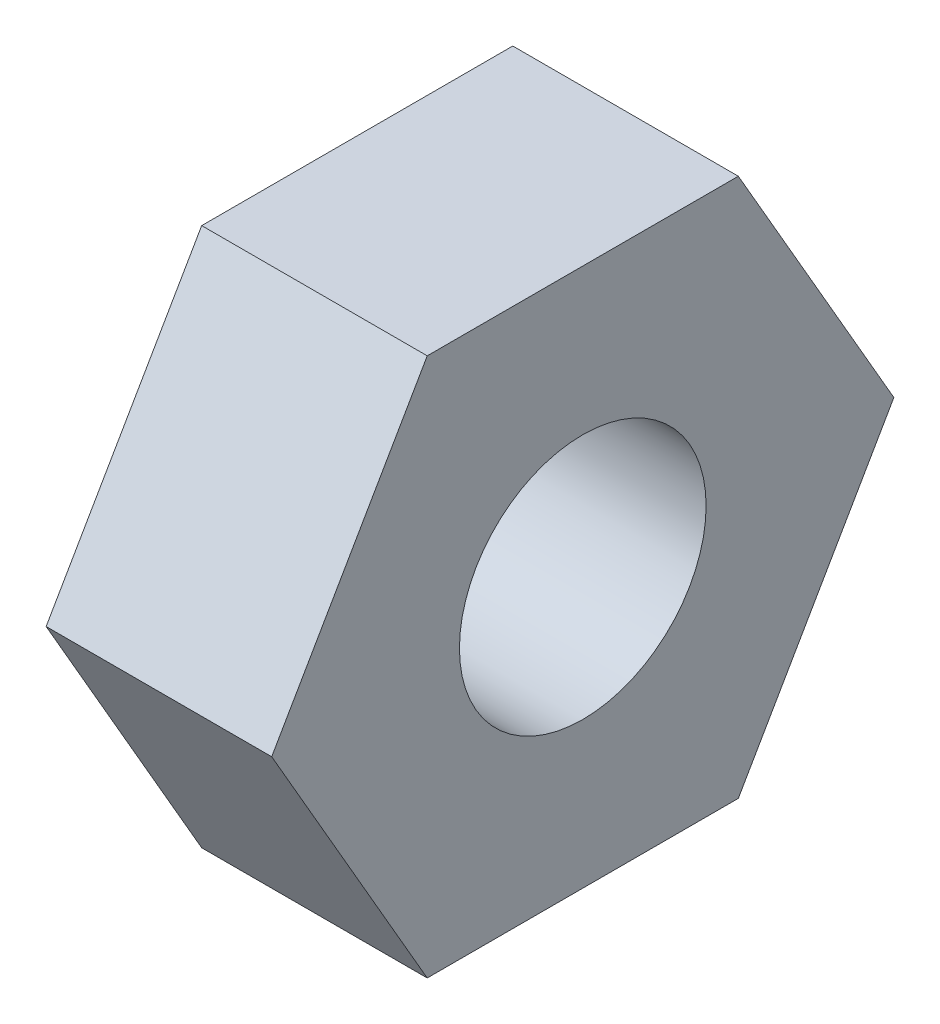
ISO-10303-21;
HEADER;
FILE_DESCRIPTION(('STEP AP214'),'2;1');
FILE_NAME('part.step','',(''),(''),'','','');
FILE_SCHEMA(('AUTOMOTIVE_DESIGN { 1 0 10303 214 1 1 1 1 }'));
ENDSEC;
DATA;
#1=APPLICATION_CONTEXT('core data for automotive mechanical design processes');
#2=APPLICATION_PROTOCOL_DEFINITION('international standard','automotive_design',2000,#1);
#3=PRODUCT_CONTEXT('',#1,'mechanical');
#4=PRODUCT('Part','Part','',(#3));
#5=PRODUCT_RELATED_PRODUCT_CATEGORY('part','',(#4));
#6=PRODUCT_DEFINITION_FORMATION('','',#4);
#7=PRODUCT_DEFINITION_CONTEXT('part definition',#1,'design');
#8=PRODUCT_DEFINITION('design','',#6,#7);
#9=PRODUCT_DEFINITION_SHAPE('','',#8);
#10=(LENGTH_UNIT() NAMED_UNIT(*) SI_UNIT(.MILLI.,.METRE.));
#11=(NAMED_UNIT(*) PLANE_ANGLE_UNIT() SI_UNIT($,.RADIAN.));
#12=(NAMED_UNIT(*) SI_UNIT($,.STERADIAN.) SOLID_ANGLE_UNIT());
#13=UNCERTAINTY_MEASURE_WITH_UNIT(LENGTH_MEASURE(1.E-05),#10,'distance_accuracy_value','');
#14=(GEOMETRIC_REPRESENTATION_CONTEXT(3) GLOBAL_UNCERTAINTY_ASSIGNED_CONTEXT((#13)) GLOBAL_UNIT_ASSIGNED_CONTEXT((#10,
#11,#12)) REPRESENTATION_CONTEXT('',''));
#15=CARTESIAN_POINT('',(0.,0.,0.));
#16=DIRECTION('',(0.,0.,1.));
#17=DIRECTION('',(1.,0.,0.));
#18=AXIS2_PLACEMENT_3D('',#15,#16,#17);
#19=CARTESIAN_POINT('',(2.286,-2.73049999999998,-1.57645491002231));
#20=DIRECTION('',(0.,0.499999999999995,0.866025403784441));
#21=DIRECTION('',(0.,-0.866025403784442,0.499999999999995));
#22=AXIS2_PLACEMENT_3D('',#19,#20,#21);
#23=PLANE('',#22);
#24=DIRECTION('',(0.,0.866025403784441,-0.499999999999995));
#25=VECTOR('',#24,1.);
#26=CARTESIAN_POINT('',(0.,-2.73049999999998,-1.57645491002231));
#27=LINE('',#26,#25);
#28=CARTESIAN_POINT('',(0.,-2.73049999999998,-1.57645491002231));
#29=VERTEX_POINT('',#28);
#30=CARTESIAN_POINT('',(0.,0.,-3.15290982004455));
#31=VERTEX_POINT('',#30);
#32=EDGE_CURVE('E125',#29,#31,#27,.T.);
#33=ORIENTED_EDGE('',*,*,#32,.T.);
#34=DIRECTION('',(-1.,0.,0.));
#35=VECTOR('',#34,1.);
#36=CARTESIAN_POINT('',(2.286,0.,-3.15290982004455));
#37=LINE('',#36,#35);
#38=CARTESIAN_POINT('',(2.286,0.,-3.15290982004455));
#39=VERTEX_POINT('',#38);
#40=EDGE_CURVE('E11',#39,#31,#37,.T.);
#41=ORIENTED_EDGE('',*,*,#40,.F.);
#42=DIRECTION('',(0.,0.866025403784441,-0.499999999999995));
#43=VECTOR('',#42,1.);
#44=CARTESIAN_POINT('',(2.286,-2.73049999999998,-1.57645491002231));
#45=LINE('',#44,#43);
#46=CARTESIAN_POINT('',(2.286,-2.73049999999998,-1.57645491002231));
#47=VERTEX_POINT('',#46);
#48=EDGE_CURVE('E136',#47,#39,#45,.T.);
#49=ORIENTED_EDGE('',*,*,#48,.F.);
#50=DIRECTION('',(-1.,0.,0.));
#51=VECTOR('',#50,1.);
#52=CARTESIAN_POINT('',(2.286,-2.73049999999998,-1.57645491002231));
#53=LINE('',#52,#51);
#54=EDGE_CURVE('E121',#47,#29,#53,.T.);
#55=ORIENTED_EDGE('',*,*,#54,.T.);
#56=EDGE_LOOP('',(#33,#41,#49,#55));
#57=FACE_BOUND('',#56,.T.);
#58=ADVANCED_FACE('F41',(#57),#23,.F.);
#59=CARTESIAN_POINT('',(2.286,0.,-3.15290982004455));
#60=DIRECTION('',(0.,-0.500000000000001,0.866025403784438));
#61=DIRECTION('',(0.,-0.866025403784438,-0.500000000000001));
#62=AXIS2_PLACEMENT_3D('',#59,#60,#61);
#63=PLANE('',#62);
#64=DIRECTION('',(0.,0.866025403784438,0.500000000000001));
#65=VECTOR('',#64,1.);
#66=CARTESIAN_POINT('',(0.,0.,-3.15290982004455));
#67=LINE('',#66,#65);
#68=CARTESIAN_POINT('',(0.,2.73050000000001,-1.57645491002227));
#69=VERTEX_POINT('',#68);
#70=EDGE_CURVE('E128',#31,#69,#67,.T.);
#71=ORIENTED_EDGE('',*,*,#70,.T.);
#72=DIRECTION('',(-1.,0.,0.));
#73=VECTOR('',#72,1.);
#74=CARTESIAN_POINT('',(2.286,2.73050000000001,-1.57645491002227));
#75=LINE('',#74,#73);
#76=CARTESIAN_POINT('',(2.286,2.73050000000001,-1.57645491002227));
#77=VERTEX_POINT('',#76);
#78=EDGE_CURVE('E49',#77,#69,#75,.T.);
#79=ORIENTED_EDGE('',*,*,#78,.F.);
#80=DIRECTION('',(0.,0.866025403784438,0.500000000000001));
#81=VECTOR('',#80,1.);
#82=CARTESIAN_POINT('',(2.286,0.,-3.15290982004455));
#83=LINE('',#82,#81);
#84=EDGE_CURVE('E94',#39,#77,#83,.T.);
#85=ORIENTED_EDGE('',*,*,#84,.F.);
#86=ORIENTED_EDGE('',*,*,#40,.T.);
#87=EDGE_LOOP('',(#71,#79,#85,#86));
#88=FACE_BOUND('',#87,.T.);
#89=ADVANCED_FACE('F161',(#88),#63,.F.);
#90=CARTESIAN_POINT('',(2.286,2.73050000000001,-1.57645491002227));
#91=DIRECTION('',(0.,-1.,0.));
#92=DIRECTION('',(0.,0.,-1.));
#93=AXIS2_PLACEMENT_3D('',#90,#91,#92);
#94=PLANE('',#93);
#95=DIRECTION('',(0.,0.,1.));
#96=VECTOR('',#95,1.);
#97=CARTESIAN_POINT('',(0.,2.73050000000001,-1.57645491002227));
#98=LINE('',#97,#96);
#99=CARTESIAN_POINT('',(0.,2.73049999999999,1.57645491002229));
#100=VERTEX_POINT('',#99);
#101=EDGE_CURVE('E131',#69,#100,#98,.T.);
#102=ORIENTED_EDGE('',*,*,#101,.T.);
#103=DIRECTION('',(-1.,0.,0.));
#104=VECTOR('',#103,1.);
#105=CARTESIAN_POINT('',(2.286,2.73049999999999,1.57645491002229));
#106=LINE('',#105,#104);
#107=CARTESIAN_POINT('',(2.286,2.73049999999999,1.57645491002229));
#108=VERTEX_POINT('',#107);
#109=EDGE_CURVE('E116',#108,#100,#106,.T.);
#110=ORIENTED_EDGE('',*,*,#109,.F.);
#111=DIRECTION('',(0.,0.,1.));
#112=VECTOR('',#111,1.);
#113=CARTESIAN_POINT('',(2.286,2.73050000000001,-1.57645491002227));
#114=LINE('',#113,#112);
#115=EDGE_CURVE('E107',#77,#108,#114,.T.);
#116=ORIENTED_EDGE('',*,*,#115,.F.);
#117=ORIENTED_EDGE('',*,*,#78,.T.);
#118=EDGE_LOOP('',(#102,#110,#116,#117));
#119=FACE_BOUND('',#118,.T.);
#120=ADVANCED_FACE('F142',(#119),#94,.F.);
#121=CARTESIAN_POINT('',(2.286,2.73049999999999,1.57645491002229));
#122=DIRECTION('',(0.,-0.499999999999995,-0.866025403784442));
#123=DIRECTION('',(0.,0.866025403784442,-0.499999999999995));
#124=AXIS2_PLACEMENT_3D('',#121,#122,#123);
#125=PLANE('',#124);
#126=DIRECTION('',(0.,-0.866025403784441,0.499999999999995));
#127=VECTOR('',#126,1.);
#128=CARTESIAN_POINT('',(0.,2.73049999999999,1.57645491002229));
#129=LINE('',#128,#127);
#130=CARTESIAN_POINT('',(0.,0.,3.15290982004455));
#131=VERTEX_POINT('',#130);
#132=EDGE_CURVE('E115',#100,#131,#129,.T.);
#133=ORIENTED_EDGE('',*,*,#132,.T.);
#134=DIRECTION('',(-1.,0.,0.));
#135=VECTOR('',#134,1.);
#136=CARTESIAN_POINT('',(2.286,0.,3.15290982004455));
#137=LINE('',#136,#135);
#138=CARTESIAN_POINT('',(2.286,0.,3.15290982004455));
#139=VERTEX_POINT('',#138);
#140=EDGE_CURVE('E112',#139,#131,#137,.T.);
#141=ORIENTED_EDGE('',*,*,#140,.F.);
#142=DIRECTION('',(0.,-0.866025403784441,0.499999999999995));
#143=VECTOR('',#142,1.);
#144=CARTESIAN_POINT('',(2.286,2.73049999999999,1.57645491002229));
#145=LINE('',#144,#143);
#146=EDGE_CURVE('E101',#108,#139,#145,.T.);
#147=ORIENTED_EDGE('',*,*,#146,.F.);
#148=ORIENTED_EDGE('',*,*,#109,.T.);
#149=EDGE_LOOP('',(#133,#141,#147,#148));
#150=FACE_BOUND('',#149,.T.);
#151=ADVANCED_FACE('F113',(#150),#125,.F.);
#152=CARTESIAN_POINT('',(2.286,0.,3.15290982004455));
#153=DIRECTION('',(0.,0.500000000000007,-0.866025403784435));
#154=DIRECTION('',(0.,0.866025403784435,0.500000000000007));
#155=AXIS2_PLACEMENT_3D('',#152,#153,#154);
#156=PLANE('',#155);
#157=DIRECTION('',(0.,-0.866025403784434,-0.500000000000007));
#158=VECTOR('',#157,1.);
#159=CARTESIAN_POINT('',(0.,0.,3.15290982004455));
#160=LINE('',#159,#158);
#161=CARTESIAN_POINT('',(0.,-2.73050000000002,1.57645491002225));
#162=VERTEX_POINT('',#161);
#163=EDGE_CURVE('E80',#131,#162,#160,.T.);
#164=ORIENTED_EDGE('',*,*,#163,.T.);
#165=DIRECTION('',(-1.,0.,0.));
#166=VECTOR('',#165,1.);
#167=CARTESIAN_POINT('',(2.286,-2.73050000000002,1.57645491002225));
#168=LINE('',#167,#166);
#169=CARTESIAN_POINT('',(2.286,-2.73050000000002,1.57645491002225));
#170=VERTEX_POINT('',#169);
#171=EDGE_CURVE('E117',#170,#162,#168,.T.);
#172=ORIENTED_EDGE('',*,*,#171,.F.);
#173=DIRECTION('',(0.,-0.866025403784434,-0.500000000000007));
#174=VECTOR('',#173,1.);
#175=CARTESIAN_POINT('',(2.286,0.,3.15290982004455));
#176=LINE('',#175,#174);
#177=EDGE_CURVE('E105',#139,#170,#176,.T.);
#178=ORIENTED_EDGE('',*,*,#177,.F.);
#179=ORIENTED_EDGE('',*,*,#140,.T.);
#180=EDGE_LOOP('',(#164,#172,#178,#179));
#181=FACE_BOUND('',#180,.T.);
#182=ADVANCED_FACE('F119',(#181),#156,.F.);
#183=CARTESIAN_POINT('',(2.286,-2.73050000000002,1.57645491002225));
#184=DIRECTION('',(0.,1.,0.));
#185=DIRECTION('',(0.,0.,1.));
#186=AXIS2_PLACEMENT_3D('',#183,#184,#185);
#187=PLANE('',#186);
#188=DIRECTION('',(0.,0.,-1.));
#189=VECTOR('',#188,1.);
#190=CARTESIAN_POINT('',(0.,-2.73050000000002,1.57645491002225));
#191=LINE('',#190,#189);
#192=EDGE_CURVE('E86',#162,#29,#191,.T.);
#193=ORIENTED_EDGE('',*,*,#192,.T.);
#194=ORIENTED_EDGE('',*,*,#54,.F.);
#195=DIRECTION('',(0.,0.,-1.));
#196=VECTOR('',#195,1.);
#197=CARTESIAN_POINT('',(2.286,-2.73050000000002,1.57645491002225));
#198=LINE('',#197,#196);
#199=EDGE_CURVE('E57',#170,#47,#198,.T.);
#200=ORIENTED_EDGE('',*,*,#199,.F.);
#201=ORIENTED_EDGE('',*,*,#171,.T.);
#202=EDGE_LOOP('',(#193,#194,#200,#201));
#203=FACE_BOUND('',#202,.T.);
#204=ADVANCED_FACE('F149',(#203),#187,.F.);
#205=CARTESIAN_POINT('',(2.286,0.,0.));
#206=DIRECTION('',(1.,0.,0.));
#207=DIRECTION('',(0.,0.,-1.));
#208=AXIS2_PLACEMENT_3D('',#205,#206,#207);
#209=PLANE('',#208);
#210=CARTESIAN_POINT('',(2.286,0.,0.));
#211=DIRECTION('',(1.,0.,0.));
#212=DIRECTION('',(0.,0.,-1.));
#213=AXIS2_PLACEMENT_3D('',#210,#211,#212);
#214=CIRCLE('',#213,1.25);
#215=CARTESIAN_POINT('',(2.286,0.,-1.25));
#216=VERTEX_POINT('',#215);
#217=EDGE_CURVE('E215',#216,#216,#214,.T.);
#218=ORIENTED_EDGE('',*,*,#217,.F.);
#219=EDGE_LOOP('',(#218));
#220=FACE_BOUND('',#219,.T.);
#221=ORIENTED_EDGE('',*,*,#48,.T.);
#222=ORIENTED_EDGE('',*,*,#84,.T.);
#223=ORIENTED_EDGE('',*,*,#115,.T.);
#224=ORIENTED_EDGE('',*,*,#146,.T.);
#225=ORIENTED_EDGE('',*,*,#177,.T.);
#226=ORIENTED_EDGE('',*,*,#199,.T.);
#227=EDGE_LOOP('',(#221,#222,#223,#224,#225,#226));
#228=FACE_BOUND('',#227,.T.);
#229=ADVANCED_FACE('F103',(#220,#228),#209,.T.);
#230=CARTESIAN_POINT('',(0.,0.,0.));
#231=DIRECTION('',(1.,0.,0.));
#232=DIRECTION('',(0.,0.,-1.));
#233=AXIS2_PLACEMENT_3D('',#230,#231,#232);
#234=PLANE('',#233);
#235=CARTESIAN_POINT('',(0.,0.,0.));
#236=DIRECTION('',(1.,0.,0.));
#237=DIRECTION('',(0.,0.,-1.));
#238=AXIS2_PLACEMENT_3D('',#235,#236,#237);
#239=CIRCLE('',#238,1.25);
#240=CARTESIAN_POINT('',(0.,0.,-1.25));
#241=VERTEX_POINT('',#240);
#242=EDGE_CURVE('E129',#241,#241,#239,.T.);
#243=ORIENTED_EDGE('',*,*,#242,.T.);
#244=EDGE_LOOP('',(#243));
#245=FACE_BOUND('',#244,.T.);
#246=ORIENTED_EDGE('',*,*,#32,.F.);
#247=ORIENTED_EDGE('',*,*,#192,.F.);
#248=ORIENTED_EDGE('',*,*,#163,.F.);
#249=ORIENTED_EDGE('',*,*,#132,.F.);
#250=ORIENTED_EDGE('',*,*,#101,.F.);
#251=ORIENTED_EDGE('',*,*,#70,.F.);
#252=EDGE_LOOP('',(#246,#247,#248,#249,#250,#251));
#253=FACE_BOUND('',#252,.T.);
#254=ADVANCED_FACE('F145',(#245,#253),#234,.F.);
#255=CARTESIAN_POINT('',(2.286,0.,0.));
#256=DIRECTION('',(1.,0.,0.));
#257=DIRECTION('',(0.,0.,-1.));
#258=AXIS2_PLACEMENT_3D('',#255,#256,#257);
#259=CYLINDRICAL_SURFACE('',#258,1.25);
#260=ORIENTED_EDGE('',*,*,#217,.T.);
#261=EDGE_LOOP('',(#260));
#262=FACE_BOUND('',#261,.T.);
#263=ORIENTED_EDGE('',*,*,#242,.F.);
#264=EDGE_LOOP('',(#263));
#265=FACE_BOUND('',#264,.T.);
#266=ADVANCED_FACE('F200',(#262,#265),#259,.F.);
#267=CLOSED_SHELL('',(#58,#89,#120,#151,#182,#204,#229,#254,#266));
#268=MANIFOLD_SOLID_BREP('B2',#267);
#269=ADVANCED_BREP_SHAPE_REPRESENTATION('',(#18,#268),#14);
#270=SHAPE_DEFINITION_REPRESENTATION(#9,#269);
ENDSEC;
END-ISO-10303-21;
